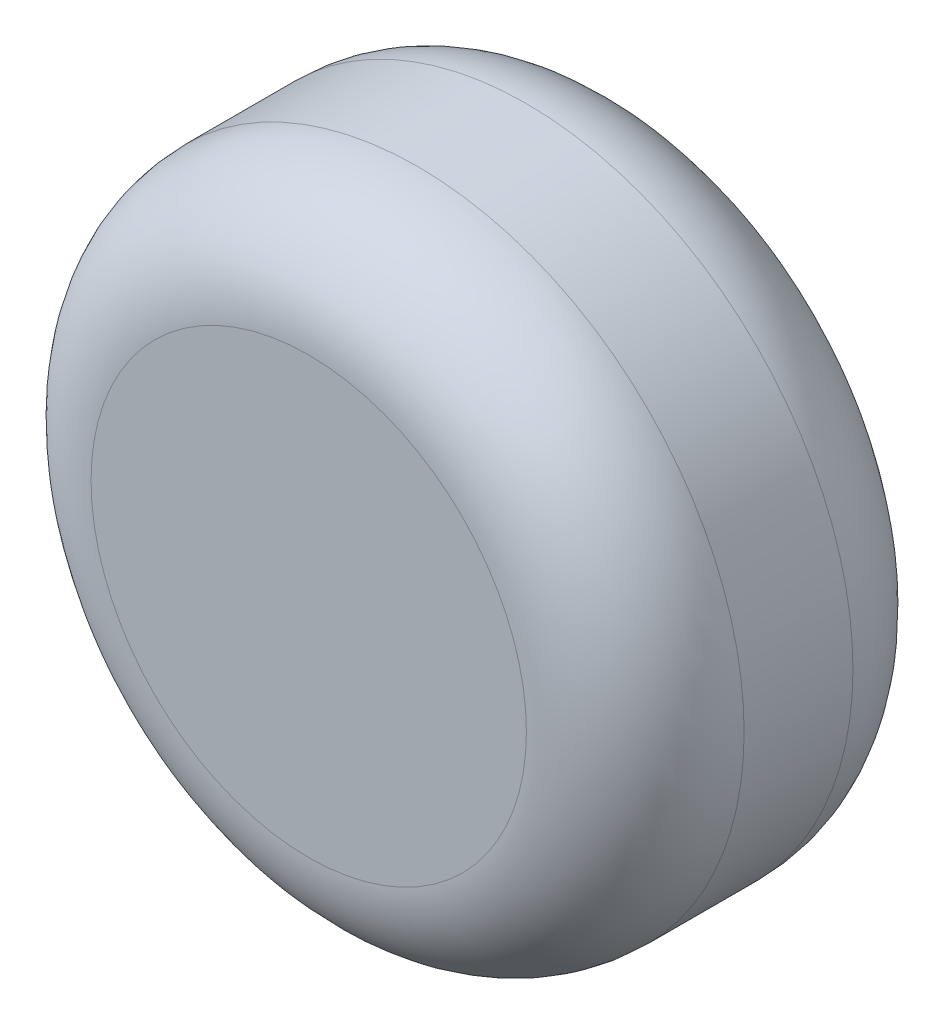
ISO-10303-21;
HEADER;
FILE_DESCRIPTION(('STEP AP214'),'2;1');
FILE_NAME('part.step','',(''),(''),'','','');
FILE_SCHEMA(('AUTOMOTIVE_DESIGN { 1 0 10303 214 1 1 1 1 }'));
ENDSEC;
DATA;
#1=APPLICATION_CONTEXT('core data for automotive mechanical design processes');
#2=APPLICATION_PROTOCOL_DEFINITION('international standard','automotive_design',2000,#1);
#3=PRODUCT_CONTEXT('',#1,'mechanical');
#4=PRODUCT('Part','Part','',(#3));
#5=PRODUCT_RELATED_PRODUCT_CATEGORY('part','',(#4));
#6=PRODUCT_DEFINITION_FORMATION('','',#4);
#7=PRODUCT_DEFINITION_CONTEXT('part definition',#1,'design');
#8=PRODUCT_DEFINITION('design','',#6,#7);
#9=PRODUCT_DEFINITION_SHAPE('','',#8);
#10=(LENGTH_UNIT() NAMED_UNIT(*) SI_UNIT(.MILLI.,.METRE.));
#11=(NAMED_UNIT(*) PLANE_ANGLE_UNIT() SI_UNIT($,.RADIAN.));
#12=(NAMED_UNIT(*) SI_UNIT($,.STERADIAN.) SOLID_ANGLE_UNIT());
#13=UNCERTAINTY_MEASURE_WITH_UNIT(LENGTH_MEASURE(1.E-05),#10,'distance_accuracy_value','');
#14=(GEOMETRIC_REPRESENTATION_CONTEXT(3) GLOBAL_UNCERTAINTY_ASSIGNED_CONTEXT((#13)) GLOBAL_UNIT_ASSIGNED_CONTEXT((#10,
#11,#12)) REPRESENTATION_CONTEXT('',''));
#15=CARTESIAN_POINT('',(0.,0.,0.));
#16=DIRECTION('',(0.,0.,1.));
#17=DIRECTION('',(1.,0.,0.));
#18=AXIS2_PLACEMENT_3D('',#15,#16,#17);
#19=CARTESIAN_POINT('',(0.,0.,76.2));
#20=DIRECTION('',(0.,0.,-1.));
#21=DIRECTION('',(-1.,0.,0.));
#22=AXIS2_PLACEMENT_3D('',#19,#20,#21);
#23=CYLINDRICAL_SURFACE('',#22,76.2);
#24=CARTESIAN_POINT('',(0.,0.,25.4));
#25=DIRECTION('',(0.,0.,1.));
#26=DIRECTION('',(1.,0.,0.));
#27=AXIS2_PLACEMENT_3D('',#24,#25,#26);
#28=CIRCLE('',#27,76.2);
#29=CARTESIAN_POINT('',(-76.2,0.,25.4));
#30=VERTEX_POINT('',#29);
#31=EDGE_CURVE('E42',#30,#30,#28,.T.);
#32=CARTESIAN_POINT('',(0.,0.,50.8));
#33=DIRECTION('',(0.,0.,1.));
#34=DIRECTION('',(1.,0.,0.));
#35=AXIS2_PLACEMENT_3D('',#32,#33,#34);
#36=CIRCLE('',#35,76.2);
#37=CARTESIAN_POINT('',(-76.2,0.,50.8));
#38=VERTEX_POINT('',#37);
#39=EDGE_CURVE('E46',#38,#38,#36,.F.);
#40=CARTESIAN_POINT('',(-76.2,0.,25.4));
#41=CARTESIAN_POINT('',(-76.2,0.,25.6645833333333));
#42=CARTESIAN_POINT('',(-76.2,0.,25.9291666666667));
#43=CARTESIAN_POINT('',(-76.2,0.,26.4583333333333));
#44=CARTESIAN_POINT('',(-76.2,0.,26.7229166666667));
#45=CARTESIAN_POINT('',(-76.2,0.,27.2520833333333));
#46=CARTESIAN_POINT('',(-76.2,0.,27.5166666666667));
#47=CARTESIAN_POINT('',(-76.2,0.,28.0458333333333));
#48=CARTESIAN_POINT('',(-76.2,0.,28.3104166666667));
#49=CARTESIAN_POINT('',(-76.2,0.,28.8395833333333));
#50=CARTESIAN_POINT('',(-76.2,0.,29.1041666666667));
#51=CARTESIAN_POINT('',(-76.2,0.,29.6333333333333));
#52=CARTESIAN_POINT('',(-76.2,0.,29.8979166666667));
#53=CARTESIAN_POINT('',(-76.2,0.,30.4270833333333));
#54=CARTESIAN_POINT('',(-76.2,0.,30.6916666666667));
#55=CARTESIAN_POINT('',(-76.2,0.,31.2208333333333));
#56=CARTESIAN_POINT('',(-76.2,0.,31.4854166666667));
#57=CARTESIAN_POINT('',(-76.2,0.,32.0145833333333));
#58=CARTESIAN_POINT('',(-76.2,0.,32.2791666666667));
#59=CARTESIAN_POINT('',(-76.2,0.,32.8083333333333));
#60=CARTESIAN_POINT('',(-76.2,0.,33.0729166666667));
#61=CARTESIAN_POINT('',(-76.2,0.,33.6020833333333));
#62=CARTESIAN_POINT('',(-76.2,0.,33.8666666666667));
#63=CARTESIAN_POINT('',(-76.2,0.,34.3958333333333));
#64=CARTESIAN_POINT('',(-76.2,0.,34.6604166666667));
#65=CARTESIAN_POINT('',(-76.2,0.,35.1895833333333));
#66=CARTESIAN_POINT('',(-76.2,0.,35.4541666666667));
#67=CARTESIAN_POINT('',(-76.2,0.,35.9833333333333));
#68=CARTESIAN_POINT('',(-76.2,0.,36.2479166666667));
#69=CARTESIAN_POINT('',(-76.2,0.,36.7770833333333));
#70=CARTESIAN_POINT('',(-76.2,0.,37.0416666666667));
#71=CARTESIAN_POINT('',(-76.2,0.,37.5708333333333));
#72=CARTESIAN_POINT('',(-76.2,0.,37.8354166666667));
#73=CARTESIAN_POINT('',(-76.2,0.,38.3645833333333));
#74=CARTESIAN_POINT('',(-76.2,0.,38.6291666666667));
#75=CARTESIAN_POINT('',(-76.2,0.,39.1583333333333));
#76=CARTESIAN_POINT('',(-76.2,0.,39.4229166666667));
#77=CARTESIAN_POINT('',(-76.2,0.,39.9520833333333));
#78=CARTESIAN_POINT('',(-76.2,0.,40.2166666666667));
#79=CARTESIAN_POINT('',(-76.2,0.,40.7458333333333));
#80=CARTESIAN_POINT('',(-76.2,0.,41.0104166666667));
#81=CARTESIAN_POINT('',(-76.2,0.,41.5395833333333));
#82=CARTESIAN_POINT('',(-76.2,0.,41.8041666666667));
#83=CARTESIAN_POINT('',(-76.2,0.,42.3333333333333));
#84=CARTESIAN_POINT('',(-76.2,0.,42.5979166666667));
#85=CARTESIAN_POINT('',(-76.2,0.,43.1270833333333));
#86=CARTESIAN_POINT('',(-76.2,0.,43.3916666666667));
#87=CARTESIAN_POINT('',(-76.2,0.,43.9208333333333));
#88=CARTESIAN_POINT('',(-76.2,0.,44.1854166666667));
#89=CARTESIAN_POINT('',(-76.2,0.,44.7145833333333));
#90=CARTESIAN_POINT('',(-76.2,0.,44.9791666666667));
#91=CARTESIAN_POINT('',(-76.2,0.,45.5083333333333));
#92=CARTESIAN_POINT('',(-76.2,0.,45.7729166666667));
#93=CARTESIAN_POINT('',(-76.2,0.,46.3020833333333));
#94=CARTESIAN_POINT('',(-76.2,0.,46.5666666666667));
#95=CARTESIAN_POINT('',(-76.2,0.,47.0958333333333));
#96=CARTESIAN_POINT('',(-76.2,0.,47.3604166666667));
#97=CARTESIAN_POINT('',(-76.2,0.,47.8895833333333));
#98=CARTESIAN_POINT('',(-76.2,0.,48.1541666666667));
#99=CARTESIAN_POINT('',(-76.2,0.,48.6833333333333));
#100=CARTESIAN_POINT('',(-76.2,0.,48.9479166666667));
#101=CARTESIAN_POINT('',(-76.2,0.,49.4770833333333));
#102=CARTESIAN_POINT('',(-76.2,0.,49.7416666666667));
#103=CARTESIAN_POINT('',(-76.2,0.,50.2708333333333));
#104=CARTESIAN_POINT('',(-76.2,0.,50.5354166666667));
#105=CARTESIAN_POINT('',(-76.2,0.,50.8));
#106=B_SPLINE_CURVE_WITH_KNOTS('',3,(#40,#41,#42,#43,#44,#45,#46,#47,#48,#49,#50,#51,#52,#53,
#54,#55,#56,#57,#58,#59,#60,#61,#62,#63,#64,#65,#66,#67,#68,#69,#70,#71,#72,#73,#74,#75,#76,#77,
#78,#79,#80,#81,#82,#83,#84,#85,#86,#87,#88,#89,#90,#91,#92,#93,#94,#95,#96,#97,#98,#99,#100,
#101,#102,#103,#104,#105),.UNSPECIFIED.,.F.,.F.,(4,2,2,2,2,2,2,2,2,2,2,2,2,2,2,2,2,2,2,2,2,2,2,
2,2,2,2,2,2,2,2,2,4),(0.,0.793750000000003,1.5875,2.38125,3.175,3.96875,4.7625,5.55625000000001,
6.35,7.14375,7.9375,8.73125,9.52500000000001,10.31875,11.1125,11.90625,12.7,13.49375,14.2875,
15.08125,15.875,16.66875,17.4625,18.25625,19.05,19.84375,20.6375,21.43125,22.225,23.01875,
23.8125,24.60625,25.4),.UNSPECIFIED.);
#107=EDGE_CURVE('BSEAM31',#30,#38,#106,.T.);
#108=ORIENTED_EDGE('',*,*,#31,.T.);
#109=ORIENTED_EDGE('',*,*,#39,.T.);
#110=ORIENTED_EDGE('',*,*,#107,.T.);
#111=ORIENTED_EDGE('',*,*,#107,.F.);
#112=EDGE_LOOP('',(#108,#110,#109,#111));
#113=FACE_BOUND('',#112,.T.);
#114=ADVANCED_FACE('F31',(#113),#23,.T.);
#115=CARTESIAN_POINT('',(0.,0.,76.2));
#116=DIRECTION('',(0.,0.,1.));
#117=DIRECTION('',(1.,0.,0.));
#118=AXIS2_PLACEMENT_3D('',#115,#116,#117);
#119=PLANE('',#118);
#120=CARTESIAN_POINT('',(0.,0.,76.2));
#121=DIRECTION('',(0.,0.,1.));
#122=DIRECTION('',(1.,0.,0.));
#123=AXIS2_PLACEMENT_3D('',#120,#121,#122);
#124=CIRCLE('',#123,50.8);
#125=CARTESIAN_POINT('',(50.8,0.,76.2));
#126=VERTEX_POINT('',#125);
#127=EDGE_CURVE('E10',#126,#126,#124,.T.);
#128=ORIENTED_EDGE('',*,*,#127,.T.);
#129=EDGE_LOOP('',(#128));
#130=FACE_BOUND('',#129,.T.);
#131=ADVANCED_FACE('F62',(#130),#119,.T.);
#132=CARTESIAN_POINT('',(0.,0.,0.));
#133=DIRECTION('',(0.,0.,1.));
#134=DIRECTION('',(1.,0.,0.));
#135=AXIS2_PLACEMENT_3D('',#132,#133,#134);
#136=PLANE('',#135);
#137=CARTESIAN_POINT('',(0.,0.,0.));
#138=DIRECTION('',(0.,0.,1.));
#139=DIRECTION('',(1.,0.,0.));
#140=AXIS2_PLACEMENT_3D('',#137,#138,#139);
#141=CIRCLE('',#140,50.8);
#142=CARTESIAN_POINT('',(50.8,0.,0.));
#143=VERTEX_POINT('',#142);
#144=EDGE_CURVE('E38',#143,#143,#141,.F.);
#145=ORIENTED_EDGE('',*,*,#144,.T.);
#146=EDGE_LOOP('',(#145));
#147=FACE_BOUND('',#146,.T.);
#148=ADVANCED_FACE('F59',(#147),#136,.F.);
#149=CARTESIAN_POINT('',(0.,0.,25.4));
#150=DIRECTION('',(0.,0.,1.));
#151=DIRECTION('',(1.,0.,0.));
#152=AXIS2_PLACEMENT_3D('',#149,#150,#151);
#153=TOROIDAL_SURFACE('',#152,50.8,25.4);
#154=ORIENTED_EDGE('',*,*,#144,.F.);
#155=EDGE_LOOP('',(#154));
#156=FACE_BOUND('',#155,.T.);
#157=ORIENTED_EDGE('',*,*,#31,.F.);
#158=EDGE_LOOP('',(#157));
#159=FACE_BOUND('',#158,.T.);
#160=ADVANCED_FACE('F55',(#156,#159),#153,.T.);
#161=CARTESIAN_POINT('',(0.,0.,50.8));
#162=DIRECTION('',(0.,0.,1.));
#163=DIRECTION('',(1.,0.,0.));
#164=AXIS2_PLACEMENT_3D('',#161,#162,#163);
#165=TOROIDAL_SURFACE('',#164,50.8,25.4);
#166=ORIENTED_EDGE('',*,*,#39,.F.);
#167=EDGE_LOOP('',(#166));
#168=FACE_BOUND('',#167,.T.);
#169=ORIENTED_EDGE('',*,*,#127,.F.);
#170=EDGE_LOOP('',(#169));
#171=FACE_BOUND('',#170,.T.);
#172=ADVANCED_FACE('F33',(#168,#171),#165,.T.);
#173=CLOSED_SHELL('',(#114,#131,#148,#160,#172));
#174=MANIFOLD_SOLID_BREP('B2',#173);
#175=ADVANCED_BREP_SHAPE_REPRESENTATION('',(#18,#174),#14);
#176=SHAPE_DEFINITION_REPRESENTATION(#9,#175);
ENDSEC;
END-ISO-10303-21;
